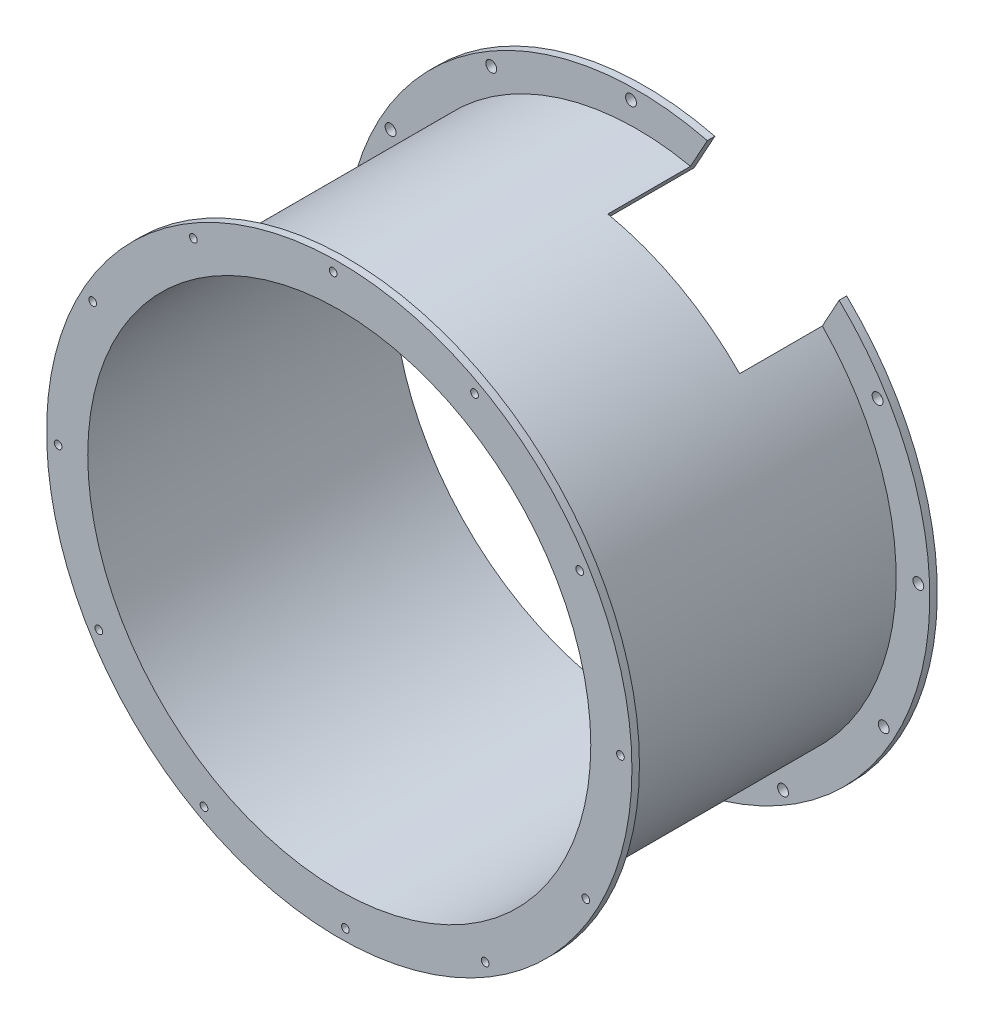
ISO-10303-21;
HEADER;
FILE_DESCRIPTION(('STEP AP214'),'2;1');
FILE_NAME('part.step','',(''),(''),'','','');
FILE_SCHEMA(('AUTOMOTIVE_DESIGN { 1 0 10303 214 1 1 1 1 }'));
ENDSEC;
DATA;
#1=APPLICATION_CONTEXT('core data for automotive mechanical design processes');
#2=APPLICATION_PROTOCOL_DEFINITION('international standard','automotive_design',2000,#1);
#3=PRODUCT_CONTEXT('',#1,'mechanical');
#4=PRODUCT('Part','Part','',(#3));
#5=PRODUCT_RELATED_PRODUCT_CATEGORY('part','',(#4));
#6=PRODUCT_DEFINITION_FORMATION('','',#4);
#7=PRODUCT_DEFINITION_CONTEXT('part definition',#1,'design');
#8=PRODUCT_DEFINITION('design','',#6,#7);
#9=PRODUCT_DEFINITION_SHAPE('','',#8);
#10=(LENGTH_UNIT() NAMED_UNIT(*) SI_UNIT(.MILLI.,.METRE.));
#11=(NAMED_UNIT(*) PLANE_ANGLE_UNIT() SI_UNIT($,.RADIAN.));
#12=(NAMED_UNIT(*) SI_UNIT($,.STERADIAN.) SOLID_ANGLE_UNIT());
#13=UNCERTAINTY_MEASURE_WITH_UNIT(LENGTH_MEASURE(1.E-05),#10,'distance_accuracy_value','');
#14=(GEOMETRIC_REPRESENTATION_CONTEXT(3) GLOBAL_UNCERTAINTY_ASSIGNED_CONTEXT((#13)) GLOBAL_UNIT_ASSIGNED_CONTEXT((#10,
#11,#12)) REPRESENTATION_CONTEXT('',''));
#15=CARTESIAN_POINT('',(0.,0.,0.));
#16=DIRECTION('',(0.,0.,1.));
#17=DIRECTION('',(1.,0.,0.));
#18=AXIS2_PLACEMENT_3D('',#15,#16,#17);
#19=CARTESIAN_POINT('',(-123.126016362815,4.95809572329235,-108.88502705223));
#20=DIRECTION('',(0.,0.,-1.));
#21=DIRECTION('',(-1.,0.,0.));
#22=AXIS2_PLACEMENT_3D('',#19,#20,#21);
#23=PLANE('',#22);
#24=CARTESIAN_POINT('',(-84.2552932690104,-59.1010315433568,-108.88502705223));
#25=DIRECTION('',(0.,0.,1.));
#26=DIRECTION('',(1.,0.,0.));
#27=AXIS2_PLACEMENT_3D('',#24,#25,#26);
#28=CIRCLE('',#27,1.45);
#29=CARTESIAN_POINT('',(-82.8052932690104,-59.1010315433568,-108.88502705223));
#30=VERTEX_POINT('',#29);
#31=EDGE_CURVE('E602',#30,#30,#28,.T.);
#32=ORIENTED_EDGE('',*,*,#31,.F.);
#33=EDGE_LOOP('',(#32));
#34=FACE_BOUND('',#33,.T.);
#35=CARTESIAN_POINT('',(-57.4334190667852,-31.0833742869837,-108.88502705223));
#36=DIRECTION('',(0.,0.,1.));
#37=DIRECTION('',(1.,0.,0.));
#38=AXIS2_PLACEMENT_3D('',#35,#36,#37);
#39=CIRCLE('',#38,1.45);
#40=CARTESIAN_POINT('',(-55.9834190667852,-31.0833742869837,-108.88502705223));
#41=VERTEX_POINT('',#40);
#42=EDGE_CURVE('E604',#41,#41,#39,.T.);
#43=ORIENTED_EDGE('',*,*,#42,.F.);
#44=EDGE_LOOP('',(#43));
#45=FACE_BOUND('',#44,.T.);
#46=CARTESIAN_POINT('',(-48.2138232587343,6.5915657526732,-108.88502705223));
#47=DIRECTION('',(0.,0.,1.));
#48=DIRECTION('',(1.,0.,0.));
#49=AXIS2_PLACEMENT_3D('',#46,#47,#48);
#50=CIRCLE('',#49,1.45);
#51=CARTESIAN_POINT('',(-46.7638232587343,6.5915657526732,-108.88502705223));
#52=VERTEX_POINT('',#51);
#53=EDGE_CURVE('E128',#52,#52,#50,.T.);
#54=ORIENTED_EDGE('',*,*,#53,.F.);
#55=EDGE_LOOP('',(#54));
#56=FACE_BOUND('',#55,.T.);
#57=CARTESIAN_POINT('',(-124.759486392196,79.8702888273732,-108.88502705223));
#58=DIRECTION('',(0.,0.,1.));
#59=DIRECTION('',(1.,0.,0.));
#60=AXIS2_PLACEMENT_3D('',#57,#58,#59);
#61=CIRCLE('',#60,1.45);
#62=CARTESIAN_POINT('',(-123.309486392196,79.8702888273732,-108.88502705223));
#63=VERTEX_POINT('',#62);
#64=EDGE_CURVE('E114',#63,#63,#61,.T.);
#65=ORIENTED_EDGE('',*,*,#64,.F.);
#66=EDGE_LOOP('',(#65));
#67=FACE_BOUND('',#66,.T.);
#68=CARTESIAN_POINT('',(-161.99673945662,69.0172229899414,-108.88502705223));
#69=DIRECTION('',(0.,0.,1.));
#70=DIRECTION('',(1.,0.,0.));
#71=AXIS2_PLACEMENT_3D('',#68,#69,#70);
#72=CIRCLE('',#71,1.44999999999998);
#73=CARTESIAN_POINT('',(-160.54673945662,69.0172229899414,-108.88502705223));
#74=VERTEX_POINT('',#73);
#75=EDGE_CURVE('E111',#74,#74,#72,.T.);
#76=ORIENTED_EDGE('',*,*,#75,.F.);
#77=EDGE_LOOP('',(#76));
#78=FACE_BOUND('',#77,.T.);
#79=CARTESIAN_POINT('',(-188.818613658845,40.9995657335684,-108.88502705223));
#80=DIRECTION('',(0.,0.,1.));
#81=DIRECTION('',(1.,0.,0.));
#82=AXIS2_PLACEMENT_3D('',#79,#80,#81);
#83=CIRCLE('',#82,1.44999999999998);
#84=CARTESIAN_POINT('',(-187.368613658845,40.9995657335684,-108.88502705223));
#85=VERTEX_POINT('',#84);
#86=EDGE_CURVE('E107',#85,#85,#83,.T.);
#87=ORIENTED_EDGE('',*,*,#86,.F.);
#88=EDGE_LOOP('',(#87));
#89=FACE_BOUND('',#88,.T.);
#90=CARTESIAN_POINT('',(-198.038209466896,3.32462569391143,-108.88502705223));
#91=DIRECTION('',(0.,0.,1.));
#92=DIRECTION('',(1.,0.,0.));
#93=AXIS2_PLACEMENT_3D('',#90,#91,#92);
#94=CIRCLE('',#93,1.44999999999998);
#95=CARTESIAN_POINT('',(-196.588209466896,3.32462569391143,-108.88502705223));
#96=VERTEX_POINT('',#95);
#97=EDGE_CURVE('E106',#96,#96,#94,.T.);
#98=ORIENTED_EDGE('',*,*,#97,.F.);
#99=EDGE_LOOP('',(#98));
#100=FACE_BOUND('',#99,.T.);
#101=CARTESIAN_POINT('',(-187.185143629464,-33.9126273705125,-108.88502705223));
#102=DIRECTION('',(0.,0.,1.));
#103=DIRECTION('',(1.,0.,0.));
#104=AXIS2_PLACEMENT_3D('',#101,#102,#103);
#105=CIRCLE('',#104,1.44999999999998);
#106=CARTESIAN_POINT('',(-185.735143629464,-33.9126273705125,-108.88502705223));
#107=VERTEX_POINT('',#106);
#108=EDGE_CURVE('E102',#107,#107,#105,.T.);
#109=ORIENTED_EDGE('',*,*,#108,.F.);
#110=EDGE_LOOP('',(#109));
#111=FACE_BOUND('',#110,.T.);
#112=CARTESIAN_POINT('',(-121.492546333434,-69.9540973807886,-108.88502705223));
#113=DIRECTION('',(0.,0.,1.));
#114=DIRECTION('',(1.,0.,0.));
#115=AXIS2_PLACEMENT_3D('',#112,#113,#114);
#116=CIRCLE('',#115,1.45);
#117=CARTESIAN_POINT('',(-120.042546333434,-69.9540973807886,-108.88502705223));
#118=VERTEX_POINT('',#117);
#119=EDGE_CURVE('E98',#118,#118,#116,.T.);
#120=ORIENTED_EDGE('',*,*,#119,.F.);
#121=EDGE_LOOP('',(#120));
#122=FACE_BOUND('',#121,.T.);
#123=CARTESIAN_POINT('',(-159.167486373091,-60.7345015727377,-108.88502705223));
#124=DIRECTION('',(0.,0.,1.));
#125=DIRECTION('',(1.,0.,0.));
#126=AXIS2_PLACEMENT_3D('',#123,#124,#125);
#127=CIRCLE('',#126,1.44999999999998);
#128=CARTESIAN_POINT('',(-157.717486373092,-60.7345015727377,-108.88502705223));
#129=VERTEX_POINT('',#128);
#130=EDGE_CURVE('E94',#129,#129,#127,.T.);
#131=ORIENTED_EDGE('',*,*,#130,.F.);
#132=EDGE_LOOP('',(#131));
#133=FACE_BOUND('',#132,.T.);
#134=CARTESIAN_POINT('',(-123.126016362815,4.95809572329235,-108.88502705223));
#135=DIRECTION('',(0.,0.,1.));
#136=DIRECTION('',(-1.,0.,0.));
#137=AXIS2_PLACEMENT_3D('',#134,#135,#136);
#138=CIRCLE('',#137,69.0115996692059);
#139=CARTESIAN_POINT('',(-108.90676901167,72.4889323364255,-108.88502705223));
#140=VERTEX_POINT('',#139);
#141=CARTESIAN_POINT('',(-73.7894198728316,53.2126409567445,-108.88502705223));
#142=VERTEX_POINT('',#141);
#143=EDGE_CURVE('E34',#140,#142,#138,.T.);
#144=ORIENTED_EDGE('',*,*,#143,.F.);
#145=DIRECTION('',(-0.48108789920628,-0.876672363678295,0.));
#146=VECTOR('',#145,1.);
#147=CARTESIAN_POINT('',(-104.422834049351,80.6598754602929,-108.88502705223));
#148=LINE('',#147,#146);
#149=CARTESIAN_POINT('',(-104.422834049351,80.6598754602929,-108.88502705223));
#150=VERTEX_POINT('',#149);
#151=EDGE_CURVE('E76',#150,#140,#148,.T.);
#152=ORIENTED_EDGE('',*,*,#151,.F.);
#153=CARTESIAN_POINT('',(-123.126016362815,4.95809572329235,-108.88502705223));
#154=DIRECTION('',(0.,0.,-1.));
#155=DIRECTION('',(-1.,0.,0.));
#156=AXIS2_PLACEMENT_3D('',#153,#154,#155);
#157=CIRCLE('',#156,77.978);
#158=CARTESIAN_POINT('',(-69.3052195252026,61.3840676844773,-108.88502705223));
#159=VERTEX_POINT('',#158);
#160=EDGE_CURVE('E74',#159,#150,#157,.T.);
#161=ORIENTED_EDGE('',*,*,#160,.F.);
#162=DIRECTION('',(0.481087899206275,0.876672363678298,0.));
#163=VECTOR('',#162,1.);
#164=CARTESIAN_POINT('',(-74.7962961921203,51.3778397817018,-108.88502705223));
#165=LINE('',#164,#163);
#166=EDGE_CURVE('E41',#142,#159,#165,.T.);
#167=ORIENTED_EDGE('',*,*,#166,.F.);
#168=EDGE_LOOP('',(#144,#152,#161,#167));
#169=FACE_BOUND('',#168,.T.);
#170=CARTESIAN_POINT('',(-59.0668890961661,43.8288188170972,-108.88502705223));
#171=DIRECTION('',(0.,0.,1.));
#172=DIRECTION('',(1.,0.,0.));
#173=AXIS2_PLACEMENT_3D('',#170,#171,#172);
#174=CIRCLE('',#173,1.45);
#175=CARTESIAN_POINT('',(-57.6168890961661,43.8288188170972,-108.88502705223));
#176=VERTEX_POINT('',#175);
#177=EDGE_CURVE('E117',#176,#176,#174,.T.);
#178=ORIENTED_EDGE('',*,*,#177,.F.);
#179=EDGE_LOOP('',(#178));
#180=FACE_BOUND('',#179,.T.);
#181=ADVANCED_FACE('F17',(#34,#45,#56,#67,#78,#89,#100,#111,#122,#133,#169,#180),#23,.F.);
#182=CARTESIAN_POINT('',(-123.126016362815,4.95809572329235,-108.88502705223));
#183=DIRECTION('',(0.,0.,-1.));
#184=DIRECTION('',(-1.,0.,0.));
#185=AXIS2_PLACEMENT_3D('',#182,#183,#184);
#186=CYLINDRICAL_SURFACE('',#185,77.978);
#187=CARTESIAN_POINT('',(-123.126016362815,4.95809572329235,-110.88502705223));
#188=DIRECTION('',(0.,0.,-1.));
#189=DIRECTION('',(-1.,0.,0.));
#190=AXIS2_PLACEMENT_3D('',#187,#188,#189);
#191=CIRCLE('',#190,77.978);
#192=CARTESIAN_POINT('',(-69.3052195252026,61.3840676844773,-110.88502705223));
#193=VERTEX_POINT('',#192);
#194=CARTESIAN_POINT('',(-104.422834049351,80.6598754602929,-110.88502705223));
#195=VERTEX_POINT('',#194);
#196=EDGE_CURVE('E62',#193,#195,#191,.T.);
#197=ORIENTED_EDGE('',*,*,#196,.F.);
#198=DIRECTION('',(0.,0.,-1.));
#199=VECTOR('',#198,1.);
#200=CARTESIAN_POINT('',(-69.3052195252026,61.3840676844773,-108.88502705223));
#201=LINE('',#200,#199);
#202=EDGE_CURVE('E11',#159,#193,#201,.T.);
#203=ORIENTED_EDGE('',*,*,#202,.F.);
#204=ORIENTED_EDGE('',*,*,#160,.T.);
#205=DIRECTION('',(0.,0.,-1.));
#206=VECTOR('',#205,1.);
#207=CARTESIAN_POINT('',(-104.422834049351,80.6598754602929,-108.88502705223));
#208=LINE('',#207,#206);
#209=EDGE_CURVE('E63',#150,#195,#208,.T.);
#210=ORIENTED_EDGE('',*,*,#209,.T.);
#211=EDGE_LOOP('',(#197,#203,#204,#210));
#212=FACE_BOUND('',#211,.T.);
#213=ADVANCED_FACE('F19',(#212),#186,.T.);
#214=CARTESIAN_POINT('',(-74.7962961921203,51.3778397817018,-108.88502705223));
#215=DIRECTION('',(-0.876672363678298,0.481087899206275,0.));
#216=DIRECTION('',(-0.481087899206275,-0.876672363678298,0.));
#217=AXIS2_PLACEMENT_3D('',#214,#215,#216);
#218=PLANE('',#217);
#219=DIRECTION('',(0.481087899206275,0.876672363678298,0.));
#220=VECTOR('',#219,1.);
#221=CARTESIAN_POINT('',(-74.7962961921203,51.3778397817018,-110.88502705223));
#222=LINE('',#221,#220);
#223=CARTESIAN_POINT('',(-74.7962961921203,51.3778397817018,-110.88502705223));
#224=VERTEX_POINT('',#223);
#225=EDGE_CURVE('E57',#224,#193,#222,.T.);
#226=ORIENTED_EDGE('',*,*,#225,.F.);
#227=DIRECTION('',(0.,0.,-1.));
#228=VECTOR('',#227,1.);
#229=CARTESIAN_POINT('',(-74.7962961921203,51.3778397817018,-108.88502705223));
#230=LINE('',#229,#228);
#231=CARTESIAN_POINT('',(-74.7962961921203,51.3778397817018,-86.8650270522294));
#232=VERTEX_POINT('',#231);
#233=EDGE_CURVE('E26',#232,#224,#230,.T.);
#234=ORIENTED_EDGE('',*,*,#233,.F.);
#235=DIRECTION('',(-0.481087899206279,-0.876672363678296,0.));
#236=VECTOR('',#235,1.);
#237=CARTESIAN_POINT('',(-74.7962961921203,51.3778397817018,-86.8650270522294));
#238=LINE('',#237,#236);
#239=CARTESIAN_POINT('',(-73.7894198728316,53.2126409567445,-86.8650270522294));
#240=VERTEX_POINT('',#239);
#241=EDGE_CURVE('E230',#240,#232,#238,.T.);
#242=ORIENTED_EDGE('',*,*,#241,.F.);
#243=DIRECTION('',(0.,0.,-1.));
#244=VECTOR('',#243,1.);
#245=CARTESIAN_POINT('',(-73.7894198728316,53.2126409567445,-86.8650270522294));
#246=LINE('',#245,#244);
#247=EDGE_CURVE('E68',#240,#142,#246,.T.);
#248=ORIENTED_EDGE('',*,*,#247,.T.);
#249=ORIENTED_EDGE('',*,*,#166,.T.);
#250=ORIENTED_EDGE('',*,*,#202,.T.);
#251=EDGE_LOOP('',(#226,#234,#242,#248,#249,#250));
#252=FACE_BOUND('',#251,.T.);
#253=ADVANCED_FACE('F53',(#252),#218,.T.);
#254=CARTESIAN_POINT('',(-104.422834049351,80.6598754602929,-108.88502705223));
#255=DIRECTION('',(0.876672363678295,-0.48108789920628,0.));
#256=DIRECTION('',(0.48108789920628,0.876672363678295,0.));
#257=AXIS2_PLACEMENT_3D('',#254,#255,#256);
#258=PLANE('',#257);
#259=DIRECTION('',(-0.48108789920628,-0.876672363678295,0.));
#260=VECTOR('',#259,1.);
#261=CARTESIAN_POINT('',(-104.422834049351,80.6598754602929,-110.88502705223));
#262=LINE('',#261,#260);
#263=CARTESIAN_POINT('',(-109.913575106506,70.6542591293428,-110.88502705223));
#264=VERTEX_POINT('',#263);
#265=EDGE_CURVE('E67',#195,#264,#262,.T.);
#266=ORIENTED_EDGE('',*,*,#265,.F.);
#267=ORIENTED_EDGE('',*,*,#209,.F.);
#268=ORIENTED_EDGE('',*,*,#151,.T.);
#269=DIRECTION('',(0.,0.,-1.));
#270=VECTOR('',#269,1.);
#271=CARTESIAN_POINT('',(-108.90676901167,72.4889323364255,-86.8650270522294));
#272=LINE('',#271,#270);
#273=CARTESIAN_POINT('',(-108.90676901167,72.4889323364255,-86.8650270522294));
#274=VERTEX_POINT('',#273);
#275=EDGE_CURVE('E239',#274,#140,#272,.T.);
#276=ORIENTED_EDGE('',*,*,#275,.F.);
#277=DIRECTION('',(0.481087899206272,0.876672363678299,0.));
#278=VECTOR('',#277,1.);
#279=CARTESIAN_POINT('',(-108.90676901167,72.4889323364255,-86.8650270522294));
#280=LINE('',#279,#278);
#281=CARTESIAN_POINT('',(-109.913575106506,70.6542591293428,-86.8650270522294));
#282=VERTEX_POINT('',#281);
#283=EDGE_CURVE('E236',#282,#274,#280,.T.);
#284=ORIENTED_EDGE('',*,*,#283,.F.);
#285=DIRECTION('',(0.,0.,-1.));
#286=VECTOR('',#285,1.);
#287=CARTESIAN_POINT('',(-109.913575106506,70.6542591293428,-108.88502705223));
#288=LINE('',#287,#286);
#289=EDGE_CURVE('E82',#282,#264,#288,.T.);
#290=ORIENTED_EDGE('',*,*,#289,.T.);
#291=EDGE_LOOP('',(#266,#267,#268,#276,#284,#290));
#292=FACE_BOUND('',#291,.T.);
#293=ADVANCED_FACE('F247',(#292),#258,.T.);
#294=CARTESIAN_POINT('',(-123.126016362815,4.95809572329235,-110.88502705223));
#295=DIRECTION('',(0.,0.,-1.));
#296=DIRECTION('',(-1.,0.,0.));
#297=AXIS2_PLACEMENT_3D('',#294,#295,#296);
#298=PLANE('',#297);
#299=CARTESIAN_POINT('',(-84.2552932690104,-59.1010315433568,-110.88502705223));
#300=DIRECTION('',(0.,0.,-1.));
#301=DIRECTION('',(-1.,0.,0.));
#302=AXIS2_PLACEMENT_3D('',#299,#300,#301);
#303=CIRCLE('',#302,1.44999999999999);
#304=CARTESIAN_POINT('',(-85.7052932690104,-59.1010315433568,-110.88502705223));
#305=VERTEX_POINT('',#304);
#306=EDGE_CURVE('E21',#305,#305,#303,.T.);
#307=ORIENTED_EDGE('',*,*,#306,.F.);
#308=EDGE_LOOP('',(#307));
#309=FACE_BOUND('',#308,.T.);
#310=CARTESIAN_POINT('',(-57.4334190667852,-31.0833742869837,-110.88502705223));
#311=DIRECTION('',(0.,0.,-1.));
#312=DIRECTION('',(-1.,0.,0.));
#313=AXIS2_PLACEMENT_3D('',#310,#311,#312);
#314=CIRCLE('',#313,1.45);
#315=CARTESIAN_POINT('',(-58.8834190667852,-31.0833742869837,-110.88502705223));
#316=VERTEX_POINT('',#315);
#317=EDGE_CURVE('E608',#316,#316,#314,.T.);
#318=ORIENTED_EDGE('',*,*,#317,.F.);
#319=EDGE_LOOP('',(#318));
#320=FACE_BOUND('',#319,.T.);
#321=CARTESIAN_POINT('',(-48.2138232587343,6.5915657526732,-110.88502705223));
#322=DIRECTION('',(0.,0.,-1.));
#323=DIRECTION('',(-1.,0.,0.));
#324=AXIS2_PLACEMENT_3D('',#321,#322,#323);
#325=CIRCLE('',#324,1.45);
#326=CARTESIAN_POINT('',(-49.6638232587343,6.5915657526732,-110.88502705223));
#327=VERTEX_POINT('',#326);
#328=EDGE_CURVE('E123',#327,#327,#325,.T.);
#329=ORIENTED_EDGE('',*,*,#328,.F.);
#330=EDGE_LOOP('',(#329));
#331=FACE_BOUND('',#330,.T.);
#332=CARTESIAN_POINT('',(-59.0668890961661,43.8288188170972,-110.88502705223));
#333=DIRECTION('',(0.,0.,-1.));
#334=DIRECTION('',(-1.,0.,0.));
#335=AXIS2_PLACEMENT_3D('',#332,#333,#334);
#336=CIRCLE('',#335,1.45);
#337=CARTESIAN_POINT('',(-60.5168890961661,43.8288188170972,-110.88502705223));
#338=VERTEX_POINT('',#337);
#339=EDGE_CURVE('E115',#338,#338,#336,.T.);
#340=ORIENTED_EDGE('',*,*,#339,.F.);
#341=EDGE_LOOP('',(#340));
#342=FACE_BOUND('',#341,.T.);
#343=CARTESIAN_POINT('',(-124.759486392196,79.8702888273732,-110.88502705223));
#344=DIRECTION('',(0.,0.,-1.));
#345=DIRECTION('',(-1.,0.,0.));
#346=AXIS2_PLACEMENT_3D('',#343,#344,#345);
#347=CIRCLE('',#346,1.44999999999999);
#348=CARTESIAN_POINT('',(-126.209486392196,79.8702888273732,-110.88502705223));
#349=VERTEX_POINT('',#348);
#350=EDGE_CURVE('E112',#349,#349,#347,.T.);
#351=ORIENTED_EDGE('',*,*,#350,.F.);
#352=EDGE_LOOP('',(#351));
#353=FACE_BOUND('',#352,.T.);
#354=CARTESIAN_POINT('',(-161.99673945662,69.0172229899414,-110.88502705223));
#355=DIRECTION('',(0.,0.,-1.));
#356=DIRECTION('',(-1.,0.,0.));
#357=AXIS2_PLACEMENT_3D('',#354,#355,#356);
#358=CIRCLE('',#357,1.44999999999998);
#359=CARTESIAN_POINT('',(-163.44673945662,69.0172229899414,-110.88502705223));
#360=VERTEX_POINT('',#359);
#361=EDGE_CURVE('E108',#360,#360,#358,.T.);
#362=ORIENTED_EDGE('',*,*,#361,.F.);
#363=EDGE_LOOP('',(#362));
#364=FACE_BOUND('',#363,.T.);
#365=CARTESIAN_POINT('',(-188.818613658845,40.9995657335684,-110.88502705223));
#366=DIRECTION('',(0.,0.,-1.));
#367=DIRECTION('',(-1.,0.,0.));
#368=AXIS2_PLACEMENT_3D('',#365,#366,#367);
#369=CIRCLE('',#368,1.44999999999998);
#370=CARTESIAN_POINT('',(-190.268613658845,40.9995657335684,-110.88502705223));
#371=VERTEX_POINT('',#370);
#372=EDGE_CURVE('E103',#371,#371,#369,.T.);
#373=ORIENTED_EDGE('',*,*,#372,.F.);
#374=EDGE_LOOP('',(#373));
#375=FACE_BOUND('',#374,.T.);
#376=CARTESIAN_POINT('',(-198.038209466896,3.32462569391143,-110.88502705223));
#377=DIRECTION('',(0.,0.,-1.));
#378=DIRECTION('',(-1.,0.,0.));
#379=AXIS2_PLACEMENT_3D('',#376,#377,#378);
#380=CIRCLE('',#379,1.44999999999998);
#381=CARTESIAN_POINT('',(-199.488209466896,3.32462569391143,-110.88502705223));
#382=VERTEX_POINT('',#381);
#383=EDGE_CURVE('E138',#382,#382,#380,.T.);
#384=ORIENTED_EDGE('',*,*,#383,.F.);
#385=EDGE_LOOP('',(#384));
#386=FACE_BOUND('',#385,.T.);
#387=CARTESIAN_POINT('',(-187.185143629464,-33.9126273705125,-110.88502705223));
#388=DIRECTION('',(0.,0.,-1.));
#389=DIRECTION('',(-1.,0.,0.));
#390=AXIS2_PLACEMENT_3D('',#387,#388,#389);
#391=CIRCLE('',#390,1.44999999999998);
#392=CARTESIAN_POINT('',(-188.635143629464,-33.9126273705125,-110.88502705223));
#393=VERTEX_POINT('',#392);
#394=EDGE_CURVE('E99',#393,#393,#391,.T.);
#395=ORIENTED_EDGE('',*,*,#394,.F.);
#396=EDGE_LOOP('',(#395));
#397=FACE_BOUND('',#396,.T.);
#398=CARTESIAN_POINT('',(-121.492546333434,-69.9540973807886,-110.88502705223));
#399=DIRECTION('',(0.,0.,-1.));
#400=DIRECTION('',(-1.,0.,0.));
#401=AXIS2_PLACEMENT_3D('',#398,#399,#400);
#402=CIRCLE('',#401,1.44999999999999);
#403=CARTESIAN_POINT('',(-122.942546333434,-69.9540973807886,-110.88502705223));
#404=VERTEX_POINT('',#403);
#405=EDGE_CURVE('E95',#404,#404,#402,.T.);
#406=ORIENTED_EDGE('',*,*,#405,.F.);
#407=EDGE_LOOP('',(#406));
#408=FACE_BOUND('',#407,.T.);
#409=CARTESIAN_POINT('',(-159.167486373091,-60.7345015727377,-110.88502705223));
#410=DIRECTION('',(0.,0.,-1.));
#411=DIRECTION('',(-1.,0.,0.));
#412=AXIS2_PLACEMENT_3D('',#409,#410,#411);
#413=CIRCLE('',#412,1.44999999999998);
#414=CARTESIAN_POINT('',(-160.617486373091,-60.7345015727377,-110.88502705223));
#415=VERTEX_POINT('',#414);
#416=EDGE_CURVE('E90',#415,#415,#413,.T.);
#417=ORIENTED_EDGE('',*,*,#416,.F.);
#418=EDGE_LOOP('',(#417));
#419=FACE_BOUND('',#418,.T.);
#420=CARTESIAN_POINT('',(-123.126016362815,4.95809572329235,-110.88502705223));
#421=DIRECTION('',(0.,0.,1.));
#422=DIRECTION('',(1.,0.,0.));
#423=AXIS2_PLACEMENT_3D('',#420,#421,#422);
#424=CIRCLE('',#423,67.0115996692059);
#425=EDGE_CURVE('E73',#264,#224,#424,.T.);
#426=ORIENTED_EDGE('',*,*,#425,.T.);
#427=ORIENTED_EDGE('',*,*,#225,.T.);
#428=ORIENTED_EDGE('',*,*,#196,.T.);
#429=ORIENTED_EDGE('',*,*,#265,.T.);
#430=EDGE_LOOP('',(#426,#427,#428,#429));
#431=FACE_BOUND('',#430,.T.);
#432=ADVANCED_FACE('F71',(#309,#320,#331,#342,#353,#364,#375,#386,#397,#408,#419,#431),#298,.T.);
#433=CARTESIAN_POINT('',(-123.126016362815,4.95809572329235,-86.8650270522294));
#434=DIRECTION('',(0.,0.,-1.));
#435=DIRECTION('',(-1.,0.,0.));
#436=AXIS2_PLACEMENT_3D('',#433,#434,#435);
#437=CYLINDRICAL_SURFACE('',#436,69.0115996692059);
#438=ORIENTED_EDGE('',*,*,#143,.T.);
#439=ORIENTED_EDGE('',*,*,#247,.F.);
#440=CARTESIAN_POINT('',(-123.126016362815,4.95809572329235,-86.8650270522294));
#441=DIRECTION('',(0.,0.,1.));
#442=DIRECTION('',(1.,0.,0.));
#443=AXIS2_PLACEMENT_3D('',#440,#441,#442);
#444=CIRCLE('',#443,69.0115996692059);
#445=EDGE_CURVE('E222',#240,#274,#444,.T.);
#446=ORIENTED_EDGE('',*,*,#445,.T.);
#447=ORIENTED_EDGE('',*,*,#275,.T.);
#448=EDGE_LOOP('',(#438,#439,#446,#447));
#449=FACE_BOUND('',#448,.T.);
#450=CARTESIAN_POINT('',(-123.126016362815,4.95809572329235,-31.5233848782294));
#451=DIRECTION('',(0.,0.,1.));
#452=DIRECTION('',(1.,0.,0.));
#453=AXIS2_PLACEMENT_3D('',#450,#451,#452);
#454=CIRCLE('',#453,69.0115996692059);
#455=CARTESIAN_POINT('',(-54.1144166936093,4.95809572329235,-31.5233848782294));
#456=VERTEX_POINT('',#455);
#457=EDGE_CURVE('E225',#456,#456,#454,.T.);
#458=ORIENTED_EDGE('',*,*,#457,.F.);
#459=EDGE_LOOP('',(#458));
#460=FACE_BOUND('',#459,.T.);
#461=ADVANCED_FACE('F251',(#449,#460),#437,.T.);
#462=CARTESIAN_POINT('',(-123.126016362815,4.95809572329235,-86.8650270522294));
#463=DIRECTION('',(0.,0.,1.));
#464=DIRECTION('',(1.,0.,0.));
#465=AXIS2_PLACEMENT_3D('',#462,#463,#464);
#466=PLANE('',#465);
#467=ORIENTED_EDGE('',*,*,#445,.F.);
#468=ORIENTED_EDGE('',*,*,#241,.T.);
#469=CARTESIAN_POINT('',(-123.126016362815,4.95809572329235,-86.8650270522294));
#470=DIRECTION('',(0.,0.,1.));
#471=DIRECTION('',(-1.,0.,0.));
#472=AXIS2_PLACEMENT_3D('',#469,#470,#471);
#473=CIRCLE('',#472,67.0115996692059);
#474=EDGE_CURVE('E233',#232,#282,#473,.T.);
#475=ORIENTED_EDGE('',*,*,#474,.T.);
#476=ORIENTED_EDGE('',*,*,#283,.T.);
#477=EDGE_LOOP('',(#467,#468,#475,#476));
#478=FACE_BOUND('',#477,.T.);
#479=ADVANCED_FACE('F260',(#478),#466,.F.);
#480=CARTESIAN_POINT('',(-123.126016362815,4.95809572329235,-29.5233848782294));
#481=DIRECTION('',(0.,0.,-1.));
#482=DIRECTION('',(-1.,0.,0.));
#483=AXIS2_PLACEMENT_3D('',#480,#481,#482);
#484=CYLINDRICAL_SURFACE('',#483,77.978);
#485=CARTESIAN_POINT('',(-123.126016362815,4.95809572329235,-29.5233848782294));
#486=DIRECTION('',(0.,0.,-1.));
#487=DIRECTION('',(1.,0.,0.));
#488=AXIS2_PLACEMENT_3D('',#485,#486,#487);
#489=CIRCLE('',#488,77.978);
#490=CARTESIAN_POINT('',(-45.1480163628152,4.95809572329235,-29.5233848782294));
#491=VERTEX_POINT('',#490);
#492=EDGE_CURVE('E219',#491,#491,#489,.T.);
#493=ORIENTED_EDGE('',*,*,#492,.T.);
#494=EDGE_LOOP('',(#493));
#495=FACE_BOUND('',#494,.T.);
#496=CARTESIAN_POINT('',(-123.126016362815,4.95809572329235,-31.5233848782294));
#497=DIRECTION('',(0.,0.,-1.));
#498=DIRECTION('',(1.,0.,0.));
#499=AXIS2_PLACEMENT_3D('',#496,#497,#498);
#500=CIRCLE('',#499,77.978);
#501=CARTESIAN_POINT('',(-45.1480163628152,4.95809572329235,-31.5233848782294));
#502=VERTEX_POINT('',#501);
#503=EDGE_CURVE('E89',#502,#502,#500,.T.);
#504=ORIENTED_EDGE('',*,*,#503,.F.);
#505=EDGE_LOOP('',(#504));
#506=FACE_BOUND('',#505,.T.);
#507=ADVANCED_FACE('F282',(#495,#506),#484,.T.);
#508=CARTESIAN_POINT('',(-123.126016362815,4.95809572329235,-29.5233848782294));
#509=DIRECTION('',(0.,0.,1.));
#510=DIRECTION('',(1.,0.,0.));
#511=AXIS2_PLACEMENT_3D('',#508,#509,#510);
#512=PLANE('',#511);
#513=CARTESIAN_POINT('',(-57.4334190667852,-31.0833742869837,-29.5233848782294));
#514=DIRECTION('',(0.,0.,1.));
#515=DIRECTION('',(1.,0.,0.));
#516=AXIS2_PLACEMENT_3D('',#513,#514,#515);
#517=CIRCLE('',#516,1.02499999999998);
#518=CARTESIAN_POINT('',(-56.4084190667852,-31.0833742869837,-29.5233848782294));
#519=VERTEX_POINT('',#518);
#520=EDGE_CURVE('E93',#519,#519,#517,.T.);
#521=ORIENTED_EDGE('',*,*,#520,.F.);
#522=EDGE_LOOP('',(#521));
#523=FACE_BOUND('',#522,.T.);
#524=CARTESIAN_POINT('',(-84.2552932690104,-59.1010315433568,-29.5233848782294));
#525=DIRECTION('',(0.,0.,1.));
#526=DIRECTION('',(1.,0.,0.));
#527=AXIS2_PLACEMENT_3D('',#524,#525,#526);
#528=CIRCLE('',#527,1.02499999999998);
#529=CARTESIAN_POINT('',(-83.2302932690104,-59.1010315433568,-29.5233848782294));
#530=VERTEX_POINT('',#529);
#531=EDGE_CURVE('E152',#530,#530,#528,.T.);
#532=ORIENTED_EDGE('',*,*,#531,.F.);
#533=EDGE_LOOP('',(#532));
#534=FACE_BOUND('',#533,.T.);
#535=CARTESIAN_POINT('',(-121.492546333434,-69.9540973807886,-29.5233848782294));
#536=DIRECTION('',(0.,0.,1.));
#537=DIRECTION('',(1.,0.,0.));
#538=AXIS2_PLACEMENT_3D('',#535,#536,#537);
#539=CIRCLE('',#538,1.02499999999998);
#540=CARTESIAN_POINT('',(-120.467546333434,-69.9540973807886,-29.5233848782294));
#541=VERTEX_POINT('',#540);
#542=EDGE_CURVE('E158',#541,#541,#539,.T.);
#543=ORIENTED_EDGE('',*,*,#542,.F.);
#544=EDGE_LOOP('',(#543));
#545=FACE_BOUND('',#544,.T.);
#546=CARTESIAN_POINT('',(-159.167486373091,-60.7345015727377,-29.5233848782294));
#547=DIRECTION('',(0.,0.,1.));
#548=DIRECTION('',(1.,0.,0.));
#549=AXIS2_PLACEMENT_3D('',#546,#547,#548);
#550=CIRCLE('',#549,1.025);
#551=CARTESIAN_POINT('',(-158.142486373092,-60.7345015727377,-29.5233848782294));
#552=VERTEX_POINT('',#551);
#553=EDGE_CURVE('E164',#552,#552,#550,.T.);
#554=ORIENTED_EDGE('',*,*,#553,.F.);
#555=EDGE_LOOP('',(#554));
#556=FACE_BOUND('',#555,.T.);
#557=CARTESIAN_POINT('',(-187.185143629464,-33.9126273705125,-29.5233848782294));
#558=DIRECTION('',(0.,0.,1.));
#559=DIRECTION('',(1.,0.,0.));
#560=AXIS2_PLACEMENT_3D('',#557,#558,#559);
#561=CIRCLE('',#560,1.025);
#562=CARTESIAN_POINT('',(-186.160143629464,-33.9126273705125,-29.5233848782294));
#563=VERTEX_POINT('',#562);
#564=EDGE_CURVE('E170',#563,#563,#561,.T.);
#565=ORIENTED_EDGE('',*,*,#564,.F.);
#566=EDGE_LOOP('',(#565));
#567=FACE_BOUND('',#566,.T.);
#568=CARTESIAN_POINT('',(-198.038209466896,3.32462569391143,-29.5233848782294));
#569=DIRECTION('',(0.,0.,1.));
#570=DIRECTION('',(1.,0.,0.));
#571=AXIS2_PLACEMENT_3D('',#568,#569,#570);
#572=CIRCLE('',#571,1.025);
#573=CARTESIAN_POINT('',(-197.013209466896,3.32462569391143,-29.5233848782294));
#574=VERTEX_POINT('',#573);
#575=EDGE_CURVE('E176',#574,#574,#572,.T.);
#576=ORIENTED_EDGE('',*,*,#575,.F.);
#577=EDGE_LOOP('',(#576));
#578=FACE_BOUND('',#577,.T.);
#579=CARTESIAN_POINT('',(-188.818613658845,40.9995657335684,-29.5233848782294));
#580=DIRECTION('',(0.,0.,1.));
#581=DIRECTION('',(1.,0.,0.));
#582=AXIS2_PLACEMENT_3D('',#579,#580,#581);
#583=CIRCLE('',#582,1.025);
#584=CARTESIAN_POINT('',(-187.793613658845,40.9995657335684,-29.5233848782294));
#585=VERTEX_POINT('',#584);
#586=EDGE_CURVE('E182',#585,#585,#583,.T.);
#587=ORIENTED_EDGE('',*,*,#586,.F.);
#588=EDGE_LOOP('',(#587));
#589=FACE_BOUND('',#588,.T.);
#590=CARTESIAN_POINT('',(-161.99673945662,69.0172229899414,-29.5233848782294));
#591=DIRECTION('',(0.,0.,1.));
#592=DIRECTION('',(1.,0.,0.));
#593=AXIS2_PLACEMENT_3D('',#590,#591,#592);
#594=CIRCLE('',#593,1.025);
#595=CARTESIAN_POINT('',(-160.97173945662,69.0172229899414,-29.5233848782294));
#596=VERTEX_POINT('',#595);
#597=EDGE_CURVE('E188',#596,#596,#594,.T.);
#598=ORIENTED_EDGE('',*,*,#597,.F.);
#599=EDGE_LOOP('',(#598));
#600=FACE_BOUND('',#599,.T.);
#601=CARTESIAN_POINT('',(-124.759486392196,79.8702888273732,-29.5233848782294));
#602=DIRECTION('',(0.,0.,1.));
#603=DIRECTION('',(1.,0.,0.));
#604=AXIS2_PLACEMENT_3D('',#601,#602,#603);
#605=CIRCLE('',#604,1.02499999999998);
#606=CARTESIAN_POINT('',(-123.734486392196,79.8702888273732,-29.5233848782294));
#607=VERTEX_POINT('',#606);
#608=EDGE_CURVE('E194',#607,#607,#605,.T.);
#609=ORIENTED_EDGE('',*,*,#608,.F.);
#610=EDGE_LOOP('',(#609));
#611=FACE_BOUND('',#610,.T.);
#612=CARTESIAN_POINT('',(-87.0845463525391,70.6506930193223,-29.5233848782294));
#613=DIRECTION('',(0.,0.,1.));
#614=DIRECTION('',(1.,0.,0.));
#615=AXIS2_PLACEMENT_3D('',#612,#613,#614);
#616=CIRCLE('',#615,1.02499999999998);
#617=CARTESIAN_POINT('',(-86.0595463525391,70.6506930193223,-29.5233848782294));
#618=VERTEX_POINT('',#617);
#619=EDGE_CURVE('E200',#618,#618,#616,.T.);
#620=ORIENTED_EDGE('',*,*,#619,.F.);
#621=EDGE_LOOP('',(#620));
#622=FACE_BOUND('',#621,.T.);
#623=CARTESIAN_POINT('',(-59.0668890961661,43.8288188170972,-29.5233848782294));
#624=DIRECTION('',(0.,0.,1.));
#625=DIRECTION('',(1.,0.,0.));
#626=AXIS2_PLACEMENT_3D('',#623,#624,#625);
#627=CIRCLE('',#626,1.02499999999998);
#628=CARTESIAN_POINT('',(-58.0418890961661,43.8288188170972,-29.5233848782294));
#629=VERTEX_POINT('',#628);
#630=EDGE_CURVE('E206',#629,#629,#627,.T.);
#631=ORIENTED_EDGE('',*,*,#630,.F.);
#632=EDGE_LOOP('',(#631));
#633=FACE_BOUND('',#632,.T.);
#634=CARTESIAN_POINT('',(-48.2138232587343,6.5915657526732,-29.5233848782294));
#635=DIRECTION('',(0.,0.,1.));
#636=DIRECTION('',(1.,0.,0.));
#637=AXIS2_PLACEMENT_3D('',#634,#635,#636);
#638=CIRCLE('',#637,1.02499999999998);
#639=CARTESIAN_POINT('',(-47.1888232587343,6.5915657526732,-29.5233848782294));
#640=VERTEX_POINT('',#639);
#641=EDGE_CURVE('E212',#640,#640,#638,.T.);
#642=ORIENTED_EDGE('',*,*,#641,.F.);
#643=EDGE_LOOP('',(#642));
#644=FACE_BOUND('',#643,.T.);
#645=CARTESIAN_POINT('',(-123.126016362815,4.95809572329235,-29.5233848782294));
#646=DIRECTION('',(0.,0.,1.));
#647=DIRECTION('',(1.,0.,0.));
#648=AXIS2_PLACEMENT_3D('',#645,#646,#647);
#649=CIRCLE('',#648,67.0115996692059);
#650=CARTESIAN_POINT('',(-56.1144166936093,4.95809572329235,-29.5233848782294));
#651=VERTEX_POINT('',#650);
#652=EDGE_CURVE('E86',#651,#651,#649,.T.);
#653=ORIENTED_EDGE('',*,*,#652,.F.);
#654=EDGE_LOOP('',(#653));
#655=FACE_BOUND('',#654,.T.);
#656=ORIENTED_EDGE('',*,*,#492,.F.);
#657=EDGE_LOOP('',(#656));
#658=FACE_BOUND('',#657,.T.);
#659=ADVANCED_FACE('F279',(#523,#534,#545,#556,#567,#578,#589,#600,#611,#622,#633,#644,#655,
#658),#512,.T.);
#660=CARTESIAN_POINT('',(-123.126016362815,4.95809572329235,-31.5233848782294));
#661=DIRECTION('',(0.,0.,1.));
#662=DIRECTION('',(1.,0.,0.));
#663=AXIS2_PLACEMENT_3D('',#660,#661,#662);
#664=PLANE('',#663);
#665=CARTESIAN_POINT('',(-57.4334190667852,-31.0833742869837,-31.5233848782294));
#666=DIRECTION('',(0.,0.,1.));
#667=DIRECTION('',(1.,0.,0.));
#668=AXIS2_PLACEMENT_3D('',#665,#666,#667);
#669=CIRCLE('',#668,1.025);
#670=CARTESIAN_POINT('',(-56.4084190667852,-31.0833742869837,-31.5233848782294));
#671=VERTEX_POINT('',#670);
#672=EDGE_CURVE('E149',#671,#671,#669,.T.);
#673=ORIENTED_EDGE('',*,*,#672,.T.);
#674=EDGE_LOOP('',(#673));
#675=FACE_BOUND('',#674,.T.);
#676=CARTESIAN_POINT('',(-84.2552932690104,-59.1010315433568,-31.5233848782294));
#677=DIRECTION('',(0.,0.,1.));
#678=DIRECTION('',(1.,0.,0.));
#679=AXIS2_PLACEMENT_3D('',#676,#677,#678);
#680=CIRCLE('',#679,1.025);
#681=CARTESIAN_POINT('',(-83.2302932690104,-59.1010315433568,-31.5233848782294));
#682=VERTEX_POINT('',#681);
#683=EDGE_CURVE('E155',#682,#682,#680,.T.);
#684=ORIENTED_EDGE('',*,*,#683,.T.);
#685=EDGE_LOOP('',(#684));
#686=FACE_BOUND('',#685,.T.);
#687=CARTESIAN_POINT('',(-121.492546333434,-69.9540973807886,-31.5233848782294));
#688=DIRECTION('',(0.,0.,1.));
#689=DIRECTION('',(1.,0.,0.));
#690=AXIS2_PLACEMENT_3D('',#687,#688,#689);
#691=CIRCLE('',#690,1.025);
#692=CARTESIAN_POINT('',(-120.467546333434,-69.9540973807886,-31.5233848782294));
#693=VERTEX_POINT('',#692);
#694=EDGE_CURVE('E161',#693,#693,#691,.T.);
#695=ORIENTED_EDGE('',*,*,#694,.T.);
#696=EDGE_LOOP('',(#695));
#697=FACE_BOUND('',#696,.T.);
#698=CARTESIAN_POINT('',(-159.167486373091,-60.7345015727377,-31.5233848782294));
#699=DIRECTION('',(0.,0.,1.));
#700=DIRECTION('',(1.,0.,0.));
#701=AXIS2_PLACEMENT_3D('',#698,#699,#700);
#702=CIRCLE('',#701,1.025);
#703=CARTESIAN_POINT('',(-158.142486373092,-60.7345015727377,-31.5233848782294));
#704=VERTEX_POINT('',#703);
#705=EDGE_CURVE('E167',#704,#704,#702,.T.);
#706=ORIENTED_EDGE('',*,*,#705,.T.);
#707=EDGE_LOOP('',(#706));
#708=FACE_BOUND('',#707,.T.);
#709=CARTESIAN_POINT('',(-187.185143629464,-33.9126273705125,-31.5233848782294));
#710=DIRECTION('',(0.,0.,1.));
#711=DIRECTION('',(1.,0.,0.));
#712=AXIS2_PLACEMENT_3D('',#709,#710,#711);
#713=CIRCLE('',#712,1.025);
#714=CARTESIAN_POINT('',(-186.160143629464,-33.9126273705125,-31.5233848782294));
#715=VERTEX_POINT('',#714);
#716=EDGE_CURVE('E173',#715,#715,#713,.T.);
#717=ORIENTED_EDGE('',*,*,#716,.T.);
#718=EDGE_LOOP('',(#717));
#719=FACE_BOUND('',#718,.T.);
#720=CARTESIAN_POINT('',(-198.038209466896,3.32462569391143,-31.5233848782294));
#721=DIRECTION('',(0.,0.,1.));
#722=DIRECTION('',(1.,0.,0.));
#723=AXIS2_PLACEMENT_3D('',#720,#721,#722);
#724=CIRCLE('',#723,1.025);
#725=CARTESIAN_POINT('',(-197.013209466896,3.32462569391143,-31.5233848782294));
#726=VERTEX_POINT('',#725);
#727=EDGE_CURVE('E179',#726,#726,#724,.T.);
#728=ORIENTED_EDGE('',*,*,#727,.T.);
#729=EDGE_LOOP('',(#728));
#730=FACE_BOUND('',#729,.T.);
#731=CARTESIAN_POINT('',(-188.818613658845,40.9995657335684,-31.5233848782294));
#732=DIRECTION('',(0.,0.,1.));
#733=DIRECTION('',(1.,0.,0.));
#734=AXIS2_PLACEMENT_3D('',#731,#732,#733);
#735=CIRCLE('',#734,1.025);
#736=CARTESIAN_POINT('',(-187.793613658845,40.9995657335684,-31.5233848782294));
#737=VERTEX_POINT('',#736);
#738=EDGE_CURVE('E185',#737,#737,#735,.T.);
#739=ORIENTED_EDGE('',*,*,#738,.T.);
#740=EDGE_LOOP('',(#739));
#741=FACE_BOUND('',#740,.T.);
#742=CARTESIAN_POINT('',(-161.99673945662,69.0172229899414,-31.5233848782294));
#743=DIRECTION('',(0.,0.,1.));
#744=DIRECTION('',(1.,0.,0.));
#745=AXIS2_PLACEMENT_3D('',#742,#743,#744);
#746=CIRCLE('',#745,1.025);
#747=CARTESIAN_POINT('',(-160.97173945662,69.0172229899414,-31.5233848782294));
#748=VERTEX_POINT('',#747);
#749=EDGE_CURVE('E191',#748,#748,#746,.T.);
#750=ORIENTED_EDGE('',*,*,#749,.T.);
#751=EDGE_LOOP('',(#750));
#752=FACE_BOUND('',#751,.T.);
#753=CARTESIAN_POINT('',(-124.759486392196,79.8702888273732,-31.5233848782294));
#754=DIRECTION('',(0.,0.,1.));
#755=DIRECTION('',(1.,0.,0.));
#756=AXIS2_PLACEMENT_3D('',#753,#754,#755);
#757=CIRCLE('',#756,1.025);
#758=CARTESIAN_POINT('',(-123.734486392196,79.8702888273732,-31.5233848782294));
#759=VERTEX_POINT('',#758);
#760=EDGE_CURVE('E197',#759,#759,#757,.T.);
#761=ORIENTED_EDGE('',*,*,#760,.T.);
#762=EDGE_LOOP('',(#761));
#763=FACE_BOUND('',#762,.T.);
#764=CARTESIAN_POINT('',(-87.0845463525391,70.6506930193223,-31.5233848782294));
#765=DIRECTION('',(0.,0.,1.));
#766=DIRECTION('',(1.,0.,0.));
#767=AXIS2_PLACEMENT_3D('',#764,#765,#766);
#768=CIRCLE('',#767,1.025);
#769=CARTESIAN_POINT('',(-86.0595463525391,70.6506930193223,-31.5233848782294));
#770=VERTEX_POINT('',#769);
#771=EDGE_CURVE('E203',#770,#770,#768,.T.);
#772=ORIENTED_EDGE('',*,*,#771,.T.);
#773=EDGE_LOOP('',(#772));
#774=FACE_BOUND('',#773,.T.);
#775=CARTESIAN_POINT('',(-59.0668890961661,43.8288188170972,-31.5233848782294));
#776=DIRECTION('',(0.,0.,1.));
#777=DIRECTION('',(1.,0.,0.));
#778=AXIS2_PLACEMENT_3D('',#775,#776,#777);
#779=CIRCLE('',#778,1.025);
#780=CARTESIAN_POINT('',(-58.0418890961661,43.8288188170972,-31.5233848782294));
#781=VERTEX_POINT('',#780);
#782=EDGE_CURVE('E209',#781,#781,#779,.T.);
#783=ORIENTED_EDGE('',*,*,#782,.T.);
#784=EDGE_LOOP('',(#783));
#785=FACE_BOUND('',#784,.T.);
#786=CARTESIAN_POINT('',(-48.2138232587343,6.5915657526732,-31.5233848782294));
#787=DIRECTION('',(0.,0.,1.));
#788=DIRECTION('',(1.,0.,0.));
#789=AXIS2_PLACEMENT_3D('',#786,#787,#788);
#790=CIRCLE('',#789,1.025);
#791=CARTESIAN_POINT('',(-47.1888232587343,6.5915657526732,-31.5233848782294));
#792=VERTEX_POINT('',#791);
#793=EDGE_CURVE('E215',#792,#792,#790,.T.);
#794=ORIENTED_EDGE('',*,*,#793,.T.);
#795=EDGE_LOOP('',(#794));
#796=FACE_BOUND('',#795,.T.);
#797=ORIENTED_EDGE('',*,*,#457,.T.);
#798=EDGE_LOOP('',(#797));
#799=FACE_BOUND('',#798,.T.);
#800=ORIENTED_EDGE('',*,*,#503,.T.);
#801=EDGE_LOOP('',(#800));
#802=FACE_BOUND('',#801,.T.);
#803=ADVANCED_FACE('F275',(#675,#686,#697,#708,#719,#730,#741,#752,#763,#774,#785,#796,#799,
#802),#664,.F.);
#804=CARTESIAN_POINT('',(-123.126016362815,4.95809572329235,-110.88502705223));
#805=DIRECTION('',(0.,0.,1.));
#806=DIRECTION('',(1.,0.,0.));
#807=AXIS2_PLACEMENT_3D('',#804,#805,#806);
#808=CYLINDRICAL_SURFACE('',#807,67.0115996692059);
#809=ORIENTED_EDGE('',*,*,#233,.T.);
#810=ORIENTED_EDGE('',*,*,#425,.F.);
#811=ORIENTED_EDGE('',*,*,#289,.F.);
#812=ORIENTED_EDGE('',*,*,#474,.F.);
#813=EDGE_LOOP('',(#809,#810,#811,#812));
#814=FACE_BOUND('',#813,.T.);
#815=ORIENTED_EDGE('',*,*,#652,.T.);
#816=EDGE_LOOP('',(#815));
#817=FACE_BOUND('',#816,.T.);
#818=ADVANCED_FACE('F271',(#814,#817),#808,.F.);
#819=CARTESIAN_POINT('',(-48.2138232587343,6.5915657526732,-29.5233848782294));
#820=DIRECTION('',(0.,0.,1.));
#821=DIRECTION('',(1.,0.,0.));
#822=AXIS2_PLACEMENT_3D('',#819,#820,#821);
#823=CYLINDRICAL_SURFACE('',#822,1.025);
#824=ORIENTED_EDGE('',*,*,#793,.F.);
#825=EDGE_LOOP('',(#824));
#826=FACE_BOUND('',#825,.T.);
#827=ORIENTED_EDGE('',*,*,#641,.T.);
#828=EDGE_LOOP('',(#827));
#829=FACE_BOUND('',#828,.T.);
#830=ADVANCED_FACE('F274',(#826,#829),#823,.F.);
#831=CARTESIAN_POINT('',(-59.0668890961661,43.8288188170972,-29.5233848782294));
#832=DIRECTION('',(0.,0.,1.));
#833=DIRECTION('',(1.,0.,0.));
#834=AXIS2_PLACEMENT_3D('',#831,#832,#833);
#835=CYLINDRICAL_SURFACE('',#834,1.025);
#836=ORIENTED_EDGE('',*,*,#782,.F.);
#837=EDGE_LOOP('',(#836));
#838=FACE_BOUND('',#837,.T.);
#839=ORIENTED_EDGE('',*,*,#630,.T.);
#840=EDGE_LOOP('',(#839));
#841=FACE_BOUND('',#840,.T.);
#842=ADVANCED_FACE('F373',(#838,#841),#835,.F.);
#843=CARTESIAN_POINT('',(-87.0845463525391,70.6506930193223,-29.5233848782294));
#844=DIRECTION('',(0.,0.,1.));
#845=DIRECTION('',(1.,0.,0.));
#846=AXIS2_PLACEMENT_3D('',#843,#844,#845);
#847=CYLINDRICAL_SURFACE('',#846,1.025);
#848=ORIENTED_EDGE('',*,*,#771,.F.);
#849=EDGE_LOOP('',(#848));
#850=FACE_BOUND('',#849,.T.);
#851=ORIENTED_EDGE('',*,*,#619,.T.);
#852=EDGE_LOOP('',(#851));
#853=FACE_BOUND('',#852,.T.);
#854=ADVANCED_FACE('F383',(#850,#853),#847,.F.);
#855=CARTESIAN_POINT('',(-124.759486392196,79.8702888273732,-29.5233848782294));
#856=DIRECTION('',(0.,0.,1.));
#857=DIRECTION('',(1.,0.,0.));
#858=AXIS2_PLACEMENT_3D('',#855,#856,#857);
#859=CYLINDRICAL_SURFACE('',#858,1.025);
#860=ORIENTED_EDGE('',*,*,#760,.F.);
#861=EDGE_LOOP('',(#860));
#862=FACE_BOUND('',#861,.T.);
#863=ORIENTED_EDGE('',*,*,#608,.T.);
#864=EDGE_LOOP('',(#863));
#865=FACE_BOUND('',#864,.T.);
#866=ADVANCED_FACE('F393',(#862,#865),#859,.F.);
#867=CARTESIAN_POINT('',(-161.99673945662,69.0172229899414,-29.5233848782294));
#868=DIRECTION('',(0.,0.,1.));
#869=DIRECTION('',(1.,0.,0.));
#870=AXIS2_PLACEMENT_3D('',#867,#868,#869);
#871=CYLINDRICAL_SURFACE('',#870,1.025);
#872=ORIENTED_EDGE('',*,*,#749,.F.);
#873=EDGE_LOOP('',(#872));
#874=FACE_BOUND('',#873,.T.);
#875=ORIENTED_EDGE('',*,*,#597,.T.);
#876=EDGE_LOOP('',(#875));
#877=FACE_BOUND('',#876,.T.);
#878=ADVANCED_FACE('F403',(#874,#877),#871,.F.);
#879=CARTESIAN_POINT('',(-188.818613658845,40.9995657335684,-29.5233848782294));
#880=DIRECTION('',(0.,0.,1.));
#881=DIRECTION('',(1.,0.,0.));
#882=AXIS2_PLACEMENT_3D('',#879,#880,#881);
#883=CYLINDRICAL_SURFACE('',#882,1.025);
#884=ORIENTED_EDGE('',*,*,#738,.F.);
#885=EDGE_LOOP('',(#884));
#886=FACE_BOUND('',#885,.T.);
#887=ORIENTED_EDGE('',*,*,#586,.T.);
#888=EDGE_LOOP('',(#887));
#889=FACE_BOUND('',#888,.T.);
#890=ADVANCED_FACE('F413',(#886,#889),#883,.F.);
#891=CARTESIAN_POINT('',(-198.038209466896,3.32462569391143,-29.5233848782294));
#892=DIRECTION('',(0.,0.,1.));
#893=DIRECTION('',(1.,0.,0.));
#894=AXIS2_PLACEMENT_3D('',#891,#892,#893);
#895=CYLINDRICAL_SURFACE('',#894,1.025);
#896=ORIENTED_EDGE('',*,*,#727,.F.);
#897=EDGE_LOOP('',(#896));
#898=FACE_BOUND('',#897,.T.);
#899=ORIENTED_EDGE('',*,*,#575,.T.);
#900=EDGE_LOOP('',(#899));
#901=FACE_BOUND('',#900,.T.);
#902=ADVANCED_FACE('F423',(#898,#901),#895,.F.);
#903=CARTESIAN_POINT('',(-187.185143629464,-33.9126273705125,-29.5233848782294));
#904=DIRECTION('',(0.,0.,1.));
#905=DIRECTION('',(1.,0.,0.));
#906=AXIS2_PLACEMENT_3D('',#903,#904,#905);
#907=CYLINDRICAL_SURFACE('',#906,1.025);
#908=ORIENTED_EDGE('',*,*,#716,.F.);
#909=EDGE_LOOP('',(#908));
#910=FACE_BOUND('',#909,.T.);
#911=ORIENTED_EDGE('',*,*,#564,.T.);
#912=EDGE_LOOP('',(#911));
#913=FACE_BOUND('',#912,.T.);
#914=ADVANCED_FACE('F433',(#910,#913),#907,.F.);
#915=CARTESIAN_POINT('',(-159.167486373091,-60.7345015727377,-29.5233848782294));
#916=DIRECTION('',(0.,0.,1.));
#917=DIRECTION('',(1.,0.,0.));
#918=AXIS2_PLACEMENT_3D('',#915,#916,#917);
#919=CYLINDRICAL_SURFACE('',#918,1.025);
#920=ORIENTED_EDGE('',*,*,#705,.F.);
#921=EDGE_LOOP('',(#920));
#922=FACE_BOUND('',#921,.T.);
#923=ORIENTED_EDGE('',*,*,#553,.T.);
#924=EDGE_LOOP('',(#923));
#925=FACE_BOUND('',#924,.T.);
#926=ADVANCED_FACE('F443',(#922,#925),#919,.F.);
#927=CARTESIAN_POINT('',(-121.492546333434,-69.9540973807886,-29.5233848782294));
#928=DIRECTION('',(0.,0.,1.));
#929=DIRECTION('',(1.,0.,0.));
#930=AXIS2_PLACEMENT_3D('',#927,#928,#929);
#931=CYLINDRICAL_SURFACE('',#930,1.025);
#932=ORIENTED_EDGE('',*,*,#694,.F.);
#933=EDGE_LOOP('',(#932));
#934=FACE_BOUND('',#933,.T.);
#935=ORIENTED_EDGE('',*,*,#542,.T.);
#936=EDGE_LOOP('',(#935));
#937=FACE_BOUND('',#936,.T.);
#938=ADVANCED_FACE('F453',(#934,#937),#931,.F.);
#939=CARTESIAN_POINT('',(-84.2552932690104,-59.1010315433568,-29.5233848782294));
#940=DIRECTION('',(0.,0.,1.));
#941=DIRECTION('',(1.,0.,0.));
#942=AXIS2_PLACEMENT_3D('',#939,#940,#941);
#943=CYLINDRICAL_SURFACE('',#942,1.025);
#944=ORIENTED_EDGE('',*,*,#683,.F.);
#945=EDGE_LOOP('',(#944));
#946=FACE_BOUND('',#945,.T.);
#947=ORIENTED_EDGE('',*,*,#531,.T.);
#948=EDGE_LOOP('',(#947));
#949=FACE_BOUND('',#948,.T.);
#950=ADVANCED_FACE('F463',(#946,#949),#943,.F.);
#951=CARTESIAN_POINT('',(-57.4334190667852,-31.0833742869837,-29.5233848782294));
#952=DIRECTION('',(0.,0.,1.));
#953=DIRECTION('',(1.,0.,0.));
#954=AXIS2_PLACEMENT_3D('',#951,#952,#953);
#955=CYLINDRICAL_SURFACE('',#954,1.025);
#956=ORIENTED_EDGE('',*,*,#672,.F.);
#957=EDGE_LOOP('',(#956));
#958=FACE_BOUND('',#957,.T.);
#959=ORIENTED_EDGE('',*,*,#520,.T.);
#960=EDGE_LOOP('',(#959));
#961=FACE_BOUND('',#960,.T.);
#962=ADVANCED_FACE('F473',(#958,#961),#955,.F.);
#963=CARTESIAN_POINT('',(-159.167486373091,-60.7345015727377,-108.88502705223));
#964=DIRECTION('',(0.,0.,1.));
#965=DIRECTION('',(1.,0.,0.));
#966=AXIS2_PLACEMENT_3D('',#963,#964,#965);
#967=CYLINDRICAL_SURFACE('',#966,1.44999999999998);
#968=ORIENTED_EDGE('',*,*,#416,.T.);
#969=EDGE_LOOP('',(#968));
#970=FACE_BOUND('',#969,.T.);
#971=ORIENTED_EDGE('',*,*,#130,.T.);
#972=EDGE_LOOP('',(#971));
#973=FACE_BOUND('',#972,.T.);
#974=ADVANCED_FACE('F483',(#970,#973),#967,.F.);
#975=CARTESIAN_POINT('',(-121.492546333434,-69.9540973807886,-108.88502705223));
#976=DIRECTION('',(0.,0.,1.));
#977=DIRECTION('',(1.,0.,0.));
#978=AXIS2_PLACEMENT_3D('',#975,#976,#977);
#979=CYLINDRICAL_SURFACE('',#978,1.44999999999999);
#980=ORIENTED_EDGE('',*,*,#405,.T.);
#981=EDGE_LOOP('',(#980));
#982=FACE_BOUND('',#981,.T.);
#983=ORIENTED_EDGE('',*,*,#119,.T.);
#984=EDGE_LOOP('',(#983));
#985=FACE_BOUND('',#984,.T.);
#986=ADVANCED_FACE('F494',(#982,#985),#979,.F.);
#987=CARTESIAN_POINT('',(-187.185143629464,-33.9126273705125,-108.88502705223));
#988=DIRECTION('',(0.,0.,1.));
#989=DIRECTION('',(1.,0.,0.));
#990=AXIS2_PLACEMENT_3D('',#987,#988,#989);
#991=CYLINDRICAL_SURFACE('',#990,1.44999999999998);
#992=ORIENTED_EDGE('',*,*,#394,.T.);
#993=EDGE_LOOP('',(#992));
#994=FACE_BOUND('',#993,.T.);
#995=ORIENTED_EDGE('',*,*,#108,.T.);
#996=EDGE_LOOP('',(#995));
#997=FACE_BOUND('',#996,.T.);
#998=ADVANCED_FACE('F504',(#994,#997),#991,.F.);
#999=CARTESIAN_POINT('',(-198.038209466896,3.32462569391143,-108.88502705223));
#1000=DIRECTION('',(0.,0.,1.));
#1001=DIRECTION('',(1.,0.,0.));
#1002=AXIS2_PLACEMENT_3D('',#999,#1000,#1001);
#1003=CYLINDRICAL_SURFACE('',#1002,1.44999999999998);
#1004=ORIENTED_EDGE('',*,*,#383,.T.);
#1005=EDGE_LOOP('',(#1004));
#1006=FACE_BOUND('',#1005,.T.);
#1007=ORIENTED_EDGE('',*,*,#97,.T.);
#1008=EDGE_LOOP('',(#1007));
#1009=FACE_BOUND('',#1008,.T.);
#1010=ADVANCED_FACE('F514',(#1006,#1009),#1003,.F.);
#1011=CARTESIAN_POINT('',(-188.818613658845,40.9995657335684,-108.88502705223));
#1012=DIRECTION('',(0.,0.,1.));
#1013=DIRECTION('',(1.,0.,0.));
#1014=AXIS2_PLACEMENT_3D('',#1011,#1012,#1013);
#1015=CYLINDRICAL_SURFACE('',#1014,1.44999999999998);
#1016=ORIENTED_EDGE('',*,*,#372,.T.);
#1017=EDGE_LOOP('',(#1016));
#1018=FACE_BOUND('',#1017,.T.);
#1019=ORIENTED_EDGE('',*,*,#86,.T.);
#1020=EDGE_LOOP('',(#1019));
#1021=FACE_BOUND('',#1020,.T.);
#1022=ADVANCED_FACE('F524',(#1018,#1021),#1015,.F.);
#1023=CARTESIAN_POINT('',(-161.99673945662,69.0172229899414,-108.88502705223));
#1024=DIRECTION('',(0.,0.,1.));
#1025=DIRECTION('',(1.,0.,0.));
#1026=AXIS2_PLACEMENT_3D('',#1023,#1024,#1025);
#1027=CYLINDRICAL_SURFACE('',#1026,1.44999999999998);
#1028=ORIENTED_EDGE('',*,*,#361,.T.);
#1029=EDGE_LOOP('',(#1028));
#1030=FACE_BOUND('',#1029,.T.);
#1031=ORIENTED_EDGE('',*,*,#75,.T.);
#1032=EDGE_LOOP('',(#1031));
#1033=FACE_BOUND('',#1032,.T.);
#1034=ADVANCED_FACE('F534',(#1030,#1033),#1027,.F.);
#1035=CARTESIAN_POINT('',(-124.759486392196,79.8702888273732,-108.88502705223));
#1036=DIRECTION('',(0.,0.,1.));
#1037=DIRECTION('',(1.,0.,0.));
#1038=AXIS2_PLACEMENT_3D('',#1035,#1036,#1037);
#1039=CYLINDRICAL_SURFACE('',#1038,1.44999999999999);
#1040=ORIENTED_EDGE('',*,*,#350,.T.);
#1041=EDGE_LOOP('',(#1040));
#1042=FACE_BOUND('',#1041,.T.);
#1043=ORIENTED_EDGE('',*,*,#64,.T.);
#1044=EDGE_LOOP('',(#1043));
#1045=FACE_BOUND('',#1044,.T.);
#1046=ADVANCED_FACE('F544',(#1042,#1045),#1039,.F.);
#1047=CARTESIAN_POINT('',(-59.0668890961661,43.8288188170972,-108.88502705223));
#1048=DIRECTION('',(0.,0.,1.));
#1049=DIRECTION('',(1.,0.,0.));
#1050=AXIS2_PLACEMENT_3D('',#1047,#1048,#1049);
#1051=CYLINDRICAL_SURFACE('',#1050,1.45);
#1052=ORIENTED_EDGE('',*,*,#339,.T.);
#1053=EDGE_LOOP('',(#1052));
#1054=FACE_BOUND('',#1053,.T.);
#1055=ORIENTED_EDGE('',*,*,#177,.T.);
#1056=EDGE_LOOP('',(#1055));
#1057=FACE_BOUND('',#1056,.T.);
#1058=ADVANCED_FACE('F554',(#1054,#1057),#1051,.F.);
#1059=CARTESIAN_POINT('',(-48.2138232587343,6.5915657526732,-108.88502705223));
#1060=DIRECTION('',(0.,0.,1.));
#1061=DIRECTION('',(1.,0.,0.));
#1062=AXIS2_PLACEMENT_3D('',#1059,#1060,#1061);
#1063=CYLINDRICAL_SURFACE('',#1062,1.45);
#1064=ORIENTED_EDGE('',*,*,#328,.T.);
#1065=EDGE_LOOP('',(#1064));
#1066=FACE_BOUND('',#1065,.T.);
#1067=ORIENTED_EDGE('',*,*,#53,.T.);
#1068=EDGE_LOOP('',(#1067));
#1069=FACE_BOUND('',#1068,.T.);
#1070=ADVANCED_FACE('F564',(#1066,#1069),#1063,.F.);
#1071=CARTESIAN_POINT('',(-57.4334190667852,-31.0833742869837,-108.88502705223));
#1072=DIRECTION('',(0.,0.,1.));
#1073=DIRECTION('',(1.,0.,0.));
#1074=AXIS2_PLACEMENT_3D('',#1071,#1072,#1073);
#1075=CYLINDRICAL_SURFACE('',#1074,1.45);
#1076=ORIENTED_EDGE('',*,*,#317,.T.);
#1077=EDGE_LOOP('',(#1076));
#1078=FACE_BOUND('',#1077,.T.);
#1079=ORIENTED_EDGE('',*,*,#42,.T.);
#1080=EDGE_LOOP('',(#1079));
#1081=FACE_BOUND('',#1080,.T.);
#1082=ADVANCED_FACE('F573',(#1078,#1081),#1075,.F.);
#1083=CARTESIAN_POINT('',(-84.2552932690104,-59.1010315433568,-108.88502705223));
#1084=DIRECTION('',(0.,0.,1.));
#1085=DIRECTION('',(1.,0.,0.));
#1086=AXIS2_PLACEMENT_3D('',#1083,#1084,#1085);
#1087=CYLINDRICAL_SURFACE('',#1086,1.44999999999999);
#1088=ORIENTED_EDGE('',*,*,#306,.T.);
#1089=EDGE_LOOP('',(#1088));
#1090=FACE_BOUND('',#1089,.T.);
#1091=ORIENTED_EDGE('',*,*,#31,.T.);
#1092=EDGE_LOOP('',(#1091));
#1093=FACE_BOUND('',#1092,.T.);
#1094=ADVANCED_FACE('F583',(#1090,#1093),#1087,.F.);
#1095=CLOSED_SHELL('',(#181,#213,#253,#293,#432,#461,#479,#507,#659,#803,#818,#830,#842,#854,
#866,#878,#890,#902,#914,#926,#938,#950,#962,#974,#986,#998,#1010,#1022,#1034,#1046,#1058,#1070,
#1082,#1094));
#1096=MANIFOLD_SOLID_BREP('B1',#1095);
#1097=ADVANCED_BREP_SHAPE_REPRESENTATION('',(#18,#1096),#14);
#1098=SHAPE_DEFINITION_REPRESENTATION(#9,#1097);
ENDSEC;
END-ISO-10303-21;
